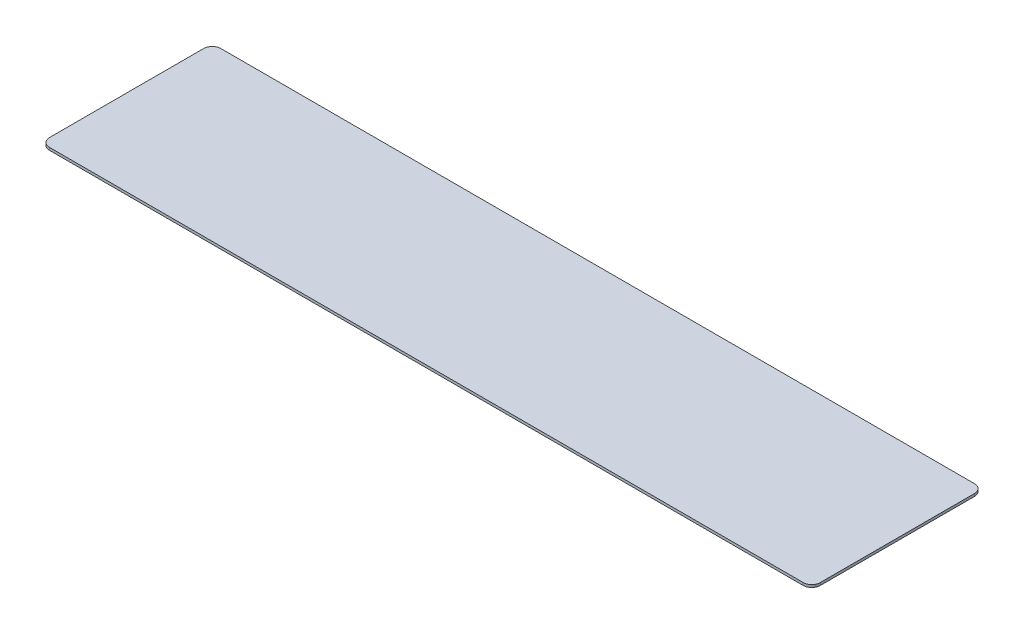
ISO-10303-21;
HEADER;
FILE_DESCRIPTION(('STEP AP214'),'2;1');
FILE_NAME('part.step','',(''),(''),'','','');
FILE_SCHEMA(('AUTOMOTIVE_DESIGN { 1 0 10303 214 1 1 1 1 }'));
ENDSEC;
DATA;
#1=APPLICATION_CONTEXT('core data for automotive mechanical design processes');
#2=APPLICATION_PROTOCOL_DEFINITION('international standard','automotive_design',2000,#1);
#3=PRODUCT_CONTEXT('',#1,'mechanical');
#4=PRODUCT('Part','Part','',(#3));
#5=PRODUCT_RELATED_PRODUCT_CATEGORY('part','',(#4));
#6=PRODUCT_DEFINITION_FORMATION('','',#4);
#7=PRODUCT_DEFINITION_CONTEXT('part definition',#1,'design');
#8=PRODUCT_DEFINITION('design','',#6,#7);
#9=PRODUCT_DEFINITION_SHAPE('','',#8);
#10=(LENGTH_UNIT() NAMED_UNIT(*) SI_UNIT(.MILLI.,.METRE.));
#11=(NAMED_UNIT(*) PLANE_ANGLE_UNIT() SI_UNIT($,.RADIAN.));
#12=(NAMED_UNIT(*) SI_UNIT($,.STERADIAN.) SOLID_ANGLE_UNIT());
#13=UNCERTAINTY_MEASURE_WITH_UNIT(LENGTH_MEASURE(1.E-05),#10,'distance_accuracy_value','');
#14=(GEOMETRIC_REPRESENTATION_CONTEXT(3) GLOBAL_UNCERTAINTY_ASSIGNED_CONTEXT((#13)) GLOBAL_UNIT_ASSIGNED_CONTEXT((#10,
#11,#12)) REPRESENTATION_CONTEXT('',''));
#15=CARTESIAN_POINT('',(0.,0.,0.));
#16=DIRECTION('',(0.,0.,1.));
#17=DIRECTION('',(1.,0.,0.));
#18=AXIS2_PLACEMENT_3D('',#15,#16,#17);
#19=CARTESIAN_POINT('',(0.,3.,0.));
#20=DIRECTION('',(1.,0.,0.));
#21=DIRECTION('',(0.,0.,-1.));
#22=AXIS2_PLACEMENT_3D('',#19,#20,#21);
#23=PLANE('',#22);
#24=DIRECTION('',(0.,0.,1.));
#25=VECTOR('',#24,1.);
#26=CARTESIAN_POINT('',(0.,3.,0.));
#27=LINE('',#26,#25);
#28=CARTESIAN_POINT('',(0.,3.,-190.));
#29=VERTEX_POINT('',#28);
#30=CARTESIAN_POINT('',(0.,3.,-10.));
#31=VERTEX_POINT('',#30);
#32=EDGE_CURVE('E128',#29,#31,#27,.T.);
#33=ORIENTED_EDGE('',*,*,#32,.F.);
#34=DIRECTION('',(0.,-1.,0.));
#35=VECTOR('',#34,1.);
#36=CARTESIAN_POINT('',(0.,3.,-190.));
#37=LINE('',#36,#35);
#38=CARTESIAN_POINT('',(0.,0.,-190.));
#39=VERTEX_POINT('',#38);
#40=EDGE_CURVE('E11',#29,#39,#37,.T.);
#41=ORIENTED_EDGE('',*,*,#40,.T.);
#42=DIRECTION('',(0.,0.,1.));
#43=VECTOR('',#42,1.);
#44=CARTESIAN_POINT('',(0.,0.,0.));
#45=LINE('',#44,#43);
#46=CARTESIAN_POINT('',(0.,0.,-10.));
#47=VERTEX_POINT('',#46);
#48=EDGE_CURVE('E130',#39,#47,#45,.T.);
#49=ORIENTED_EDGE('',*,*,#48,.T.);
#50=DIRECTION('',(0.,-1.,0.));
#51=VECTOR('',#50,1.);
#52=CARTESIAN_POINT('',(0.,3.,-10.));
#53=LINE('',#52,#51);
#54=EDGE_CURVE('E41',#47,#31,#53,.F.);
#55=ORIENTED_EDGE('',*,*,#54,.T.);
#56=EDGE_LOOP('',(#33,#41,#49,#55));
#57=FACE_BOUND('',#56,.T.);
#58=ADVANCED_FACE('F33',(#57),#23,.F.);
#59=CARTESIAN_POINT('',(0.,3.,0.));
#60=DIRECTION('',(0.,0.,-1.));
#61=DIRECTION('',(-1.,0.,0.));
#62=AXIS2_PLACEMENT_3D('',#59,#60,#61);
#63=PLANE('',#62);
#64=DIRECTION('',(1.,0.,0.));
#65=VECTOR('',#64,1.);
#66=CARTESIAN_POINT('',(0.,0.,0.));
#67=LINE('',#66,#65);
#68=CARTESIAN_POINT('',(10.,0.,0.));
#69=VERTEX_POINT('',#68);
#70=CARTESIAN_POINT('',(890.,0.,0.));
#71=VERTEX_POINT('',#70);
#72=EDGE_CURVE('E126',#69,#71,#67,.T.);
#73=ORIENTED_EDGE('',*,*,#72,.T.);
#74=DIRECTION('',(0.,-1.,0.));
#75=VECTOR('',#74,1.);
#76=CARTESIAN_POINT('',(890.,3.,0.));
#77=LINE('',#76,#75);
#78=CARTESIAN_POINT('',(890.,3.,0.));
#79=VERTEX_POINT('',#78);
#80=EDGE_CURVE('E105',#71,#79,#77,.F.);
#81=ORIENTED_EDGE('',*,*,#80,.T.);
#82=DIRECTION('',(1.,0.,0.));
#83=VECTOR('',#82,1.);
#84=CARTESIAN_POINT('',(0.,3.,0.));
#85=LINE('',#84,#83);
#86=CARTESIAN_POINT('',(10.,3.,0.));
#87=VERTEX_POINT('',#86);
#88=EDGE_CURVE('E166',#87,#79,#85,.T.);
#89=ORIENTED_EDGE('',*,*,#88,.F.);
#90=DIRECTION('',(0.,-1.,0.));
#91=VECTOR('',#90,1.);
#92=CARTESIAN_POINT('',(10.,3.,0.));
#93=LINE('',#92,#91);
#94=EDGE_CURVE('E110',#87,#69,#93,.T.);
#95=ORIENTED_EDGE('',*,*,#94,.T.);
#96=EDGE_LOOP('',(#73,#81,#89,#95));
#97=FACE_BOUND('',#96,.T.);
#98=ADVANCED_FACE('F170',(#97),#63,.F.);
#99=CARTESIAN_POINT('',(900.,3.,0.));
#100=DIRECTION('',(-1.,0.,0.));
#101=DIRECTION('',(0.,0.,1.));
#102=AXIS2_PLACEMENT_3D('',#99,#100,#101);
#103=PLANE('',#102);
#104=DIRECTION('',(0.,0.,-1.));
#105=VECTOR('',#104,1.);
#106=CARTESIAN_POINT('',(900.,3.,0.));
#107=LINE('',#106,#105);
#108=CARTESIAN_POINT('',(900.,3.,-10.));
#109=VERTEX_POINT('',#108);
#110=CARTESIAN_POINT('',(900.,3.,-190.));
#111=VERTEX_POINT('',#110);
#112=EDGE_CURVE('E119',#109,#111,#107,.T.);
#113=ORIENTED_EDGE('',*,*,#112,.F.);
#114=DIRECTION('',(0.,-1.,0.));
#115=VECTOR('',#114,1.);
#116=CARTESIAN_POINT('',(900.,3.,-10.));
#117=LINE('',#116,#115);
#118=CARTESIAN_POINT('',(900.,0.,-10.));
#119=VERTEX_POINT('',#118);
#120=EDGE_CURVE('E104',#109,#119,#117,.T.);
#121=ORIENTED_EDGE('',*,*,#120,.T.);
#122=DIRECTION('',(0.,0.,-1.));
#123=VECTOR('',#122,1.);
#124=CARTESIAN_POINT('',(900.,0.,0.));
#125=LINE('',#124,#123);
#126=CARTESIAN_POINT('',(900.,0.,-190.));
#127=VERTEX_POINT('',#126);
#128=EDGE_CURVE('E117',#119,#127,#125,.T.);
#129=ORIENTED_EDGE('',*,*,#128,.T.);
#130=DIRECTION('',(0.,-1.,0.));
#131=VECTOR('',#130,1.);
#132=CARTESIAN_POINT('',(900.,3.,-190.));
#133=LINE('',#132,#131);
#134=EDGE_CURVE('E121',#127,#111,#133,.F.);
#135=ORIENTED_EDGE('',*,*,#134,.T.);
#136=EDGE_LOOP('',(#113,#121,#129,#135));
#137=FACE_BOUND('',#136,.T.);
#138=ADVANCED_FACE('F116',(#137),#103,.F.);
#139=CARTESIAN_POINT('',(0.,3.,-200.));
#140=DIRECTION('',(0.,0.,1.));
#141=DIRECTION('',(1.,0.,0.));
#142=AXIS2_PLACEMENT_3D('',#139,#140,#141);
#143=PLANE('',#142);
#144=DIRECTION('',(-1.,0.,0.));
#145=VECTOR('',#144,1.);
#146=CARTESIAN_POINT('',(0.,3.,-200.));
#147=LINE('',#146,#145);
#148=CARTESIAN_POINT('',(890.,3.,-200.));
#149=VERTEX_POINT('',#148);
#150=CARTESIAN_POINT('',(10.,3.,-200.));
#151=VERTEX_POINT('',#150);
#152=EDGE_CURVE('E134',#149,#151,#147,.T.);
#153=ORIENTED_EDGE('',*,*,#152,.F.);
#154=DIRECTION('',(0.,-1.,0.));
#155=VECTOR('',#154,1.);
#156=CARTESIAN_POINT('',(890.,3.,-200.));
#157=LINE('',#156,#155);
#158=CARTESIAN_POINT('',(890.,0.,-200.));
#159=VERTEX_POINT('',#158);
#160=EDGE_CURVE('E151',#149,#159,#157,.T.);
#161=ORIENTED_EDGE('',*,*,#160,.T.);
#162=DIRECTION('',(-1.,0.,0.));
#163=VECTOR('',#162,1.);
#164=CARTESIAN_POINT('',(0.,0.,-200.));
#165=LINE('',#164,#163);
#166=CARTESIAN_POINT('',(10.,0.,-200.));
#167=VERTEX_POINT('',#166);
#168=EDGE_CURVE('E125',#159,#167,#165,.T.);
#169=ORIENTED_EDGE('',*,*,#168,.T.);
#170=DIRECTION('',(0.,-1.,0.));
#171=VECTOR('',#170,1.);
#172=CARTESIAN_POINT('',(10.,3.,-200.));
#173=LINE('',#172,#171);
#174=EDGE_CURVE('E48',#167,#151,#173,.F.);
#175=ORIENTED_EDGE('',*,*,#174,.T.);
#176=EDGE_LOOP('',(#153,#161,#169,#175));
#177=FACE_BOUND('',#176,.T.);
#178=ADVANCED_FACE('F177',(#177),#143,.F.);
#179=CARTESIAN_POINT('',(0.,3.,0.));
#180=DIRECTION('',(0.,-1.,0.));
#181=DIRECTION('',(0.,0.,-1.));
#182=AXIS2_PLACEMENT_3D('',#179,#180,#181);
#183=PLANE('',#182);
#184=ORIENTED_EDGE('',*,*,#88,.T.);
#185=CARTESIAN_POINT('',(890.,3.,-10.));
#186=DIRECTION('',(0.,-1.,0.));
#187=DIRECTION('',(0.,0.,-1.));
#188=AXIS2_PLACEMENT_3D('',#185,#186,#187);
#189=CIRCLE('',#188,10.);
#190=EDGE_CURVE('E148',#79,#109,#189,.F.);
#191=ORIENTED_EDGE('',*,*,#190,.T.);
#192=ORIENTED_EDGE('',*,*,#112,.T.);
#193=CARTESIAN_POINT('',(890.,3.,-190.));
#194=DIRECTION('',(0.,-1.,0.));
#195=DIRECTION('',(0.,0.,-1.));
#196=AXIS2_PLACEMENT_3D('',#193,#194,#195);
#197=CIRCLE('',#196,10.);
#198=EDGE_CURVE('E55',#111,#149,#197,.F.);
#199=ORIENTED_EDGE('',*,*,#198,.T.);
#200=ORIENTED_EDGE('',*,*,#152,.T.);
#201=CARTESIAN_POINT('',(10.,3.,-190.));
#202=DIRECTION('',(0.,-1.,0.));
#203=DIRECTION('',(0.,0.,-1.));
#204=AXIS2_PLACEMENT_3D('',#201,#202,#203);
#205=CIRCLE('',#204,10.);
#206=EDGE_CURVE('E145',#151,#29,#205,.F.);
#207=ORIENTED_EDGE('',*,*,#206,.T.);
#208=ORIENTED_EDGE('',*,*,#32,.T.);
#209=CARTESIAN_POINT('',(10.,3.,-10.));
#210=DIRECTION('',(0.,-1.,0.));
#211=DIRECTION('',(0.,0.,-1.));
#212=AXIS2_PLACEMENT_3D('',#209,#210,#211);
#213=CIRCLE('',#212,10.);
#214=EDGE_CURVE('E143',#31,#87,#213,.F.);
#215=ORIENTED_EDGE('',*,*,#214,.T.);
#216=EDGE_LOOP('',(#184,#191,#192,#199,#200,#207,#208,#215));
#217=FACE_BOUND('',#216,.T.);
#218=ADVANCED_FACE('F163',(#217),#183,.F.);
#219=CARTESIAN_POINT('',(0.,0.,0.));
#220=DIRECTION('',(0.,-1.,0.));
#221=DIRECTION('',(0.,0.,-1.));
#222=AXIS2_PLACEMENT_3D('',#219,#220,#221);
#223=PLANE('',#222);
#224=ORIENTED_EDGE('',*,*,#128,.F.);
#225=CARTESIAN_POINT('',(890.,0.,-10.));
#226=DIRECTION('',(0.,-1.,0.));
#227=DIRECTION('',(0.,0.,-1.));
#228=AXIS2_PLACEMENT_3D('',#225,#226,#227);
#229=CIRCLE('',#228,10.);
#230=EDGE_CURVE('E100',#119,#71,#229,.T.);
#231=ORIENTED_EDGE('',*,*,#230,.T.);
#232=ORIENTED_EDGE('',*,*,#72,.F.);
#233=CARTESIAN_POINT('',(10.,0.,-10.));
#234=DIRECTION('',(0.,-1.,0.));
#235=DIRECTION('',(0.,0.,-1.));
#236=AXIS2_PLACEMENT_3D('',#233,#234,#235);
#237=CIRCLE('',#236,10.);
#238=EDGE_CURVE('E120',#69,#47,#237,.T.);
#239=ORIENTED_EDGE('',*,*,#238,.T.);
#240=ORIENTED_EDGE('',*,*,#48,.F.);
#241=CARTESIAN_POINT('',(10.,0.,-190.));
#242=DIRECTION('',(0.,-1.,0.));
#243=DIRECTION('',(0.,0.,-1.));
#244=AXIS2_PLACEMENT_3D('',#241,#242,#243);
#245=CIRCLE('',#244,10.);
#246=EDGE_CURVE('E137',#39,#167,#245,.T.);
#247=ORIENTED_EDGE('',*,*,#246,.T.);
#248=ORIENTED_EDGE('',*,*,#168,.F.);
#249=CARTESIAN_POINT('',(890.,0.,-190.));
#250=DIRECTION('',(0.,-1.,0.));
#251=DIRECTION('',(0.,0.,-1.));
#252=AXIS2_PLACEMENT_3D('',#249,#250,#251);
#253=CIRCLE('',#252,10.);
#254=EDGE_CURVE('E111',#159,#127,#253,.T.);
#255=ORIENTED_EDGE('',*,*,#254,.T.);
#256=EDGE_LOOP('',(#224,#231,#232,#239,#240,#247,#248,#255));
#257=FACE_BOUND('',#256,.T.);
#258=ADVANCED_FACE('F123',(#257),#223,.T.);
#259=CARTESIAN_POINT('',(890.,3.,-10.));
#260=DIRECTION('',(0.,-1.,0.));
#261=DIRECTION('',(0.,0.,-1.));
#262=AXIS2_PLACEMENT_3D('',#259,#260,#261);
#263=CYLINDRICAL_SURFACE('',#262,10.);
#264=ORIENTED_EDGE('',*,*,#190,.F.);
#265=ORIENTED_EDGE('',*,*,#80,.F.);
#266=ORIENTED_EDGE('',*,*,#230,.F.);
#267=ORIENTED_EDGE('',*,*,#120,.F.);
#268=EDGE_LOOP('',(#264,#265,#266,#267));
#269=FACE_BOUND('',#268,.T.);
#270=ADVANCED_FACE('F103',(#269),#263,.T.);
#271=CARTESIAN_POINT('',(890.,3.,-190.));
#272=DIRECTION('',(0.,-1.,0.));
#273=DIRECTION('',(0.,0.,-1.));
#274=AXIS2_PLACEMENT_3D('',#271,#272,#273);
#275=CYLINDRICAL_SURFACE('',#274,10.);
#276=ORIENTED_EDGE('',*,*,#198,.F.);
#277=ORIENTED_EDGE('',*,*,#134,.F.);
#278=ORIENTED_EDGE('',*,*,#254,.F.);
#279=ORIENTED_EDGE('',*,*,#160,.F.);
#280=EDGE_LOOP('',(#276,#277,#278,#279));
#281=FACE_BOUND('',#280,.T.);
#282=ADVANCED_FACE('F176',(#281),#275,.T.);
#283=CARTESIAN_POINT('',(10.,3.,-190.));
#284=DIRECTION('',(0.,-1.,0.));
#285=DIRECTION('',(0.,0.,-1.));
#286=AXIS2_PLACEMENT_3D('',#283,#284,#285);
#287=CYLINDRICAL_SURFACE('',#286,10.);
#288=ORIENTED_EDGE('',*,*,#206,.F.);
#289=ORIENTED_EDGE('',*,*,#174,.F.);
#290=ORIENTED_EDGE('',*,*,#246,.F.);
#291=ORIENTED_EDGE('',*,*,#40,.F.);
#292=EDGE_LOOP('',(#288,#289,#290,#291));
#293=FACE_BOUND('',#292,.T.);
#294=ADVANCED_FACE('F179',(#293),#287,.T.);
#295=CARTESIAN_POINT('',(10.,3.,-10.));
#296=DIRECTION('',(0.,-1.,0.));
#297=DIRECTION('',(0.,0.,-1.));
#298=AXIS2_PLACEMENT_3D('',#295,#296,#297);
#299=CYLINDRICAL_SURFACE('',#298,10.);
#300=ORIENTED_EDGE('',*,*,#214,.F.);
#301=ORIENTED_EDGE('',*,*,#54,.F.);
#302=ORIENTED_EDGE('',*,*,#238,.F.);
#303=ORIENTED_EDGE('',*,*,#94,.F.);
#304=EDGE_LOOP('',(#300,#301,#302,#303));
#305=FACE_BOUND('',#304,.T.);
#306=ADVANCED_FACE('F35',(#305),#299,.T.);
#307=CLOSED_SHELL('',(#58,#98,#138,#178,#218,#258,#270,#282,#294,#306));
#308=MANIFOLD_SOLID_BREP('B2',#307);
#309=ADVANCED_BREP_SHAPE_REPRESENTATION('',(#18,#308),#14);
#310=SHAPE_DEFINITION_REPRESENTATION(#9,#309);
ENDSEC;
END-ISO-10303-21;
